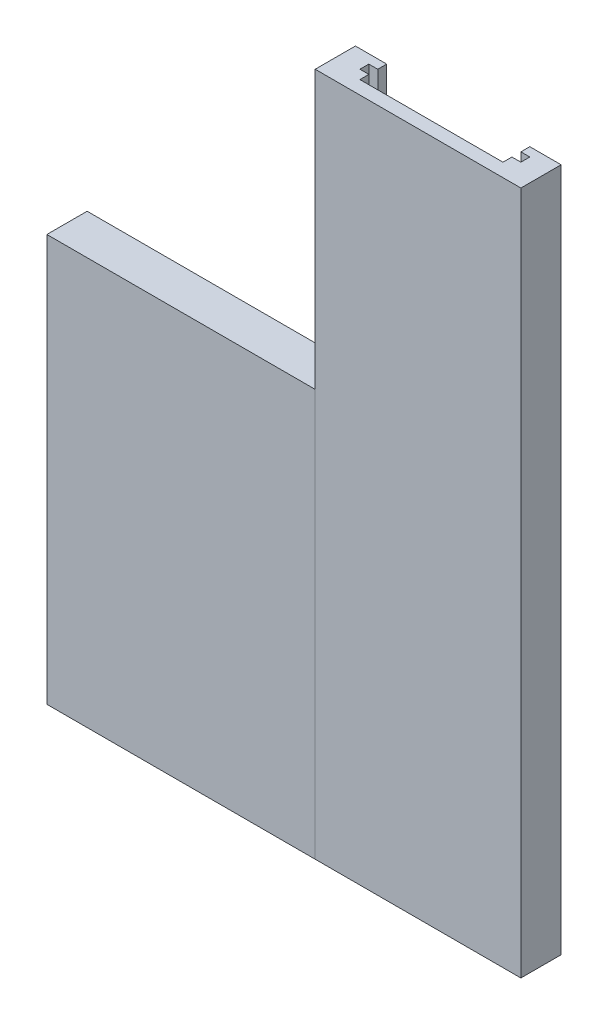
ISO-10303-21;
HEADER;
FILE_DESCRIPTION(('STEP AP214'),'2;1');
FILE_NAME('part.step','',(''),(''),'','','');
FILE_SCHEMA(('AUTOMOTIVE_DESIGN { 1 0 10303 214 1 1 1 1 }'));
ENDSEC;
DATA;
#1=APPLICATION_CONTEXT('core data for automotive mechanical design processes');
#2=APPLICATION_PROTOCOL_DEFINITION('international standard','automotive_design',2000,#1);
#3=PRODUCT_CONTEXT('',#1,'mechanical');
#4=PRODUCT('Part','Part','',(#3));
#5=PRODUCT_RELATED_PRODUCT_CATEGORY('part','',(#4));
#6=PRODUCT_DEFINITION_FORMATION('','',#4);
#7=PRODUCT_DEFINITION_CONTEXT('part definition',#1,'design');
#8=PRODUCT_DEFINITION('design','',#6,#7);
#9=PRODUCT_DEFINITION_SHAPE('','',#8);
#10=(LENGTH_UNIT() NAMED_UNIT(*) SI_UNIT(.MILLI.,.METRE.));
#11=(NAMED_UNIT(*) PLANE_ANGLE_UNIT() SI_UNIT($,.RADIAN.));
#12=(NAMED_UNIT(*) SI_UNIT($,.STERADIAN.) SOLID_ANGLE_UNIT());
#13=UNCERTAINTY_MEASURE_WITH_UNIT(LENGTH_MEASURE(1.E-05),#10,'distance_accuracy_value','');
#14=(GEOMETRIC_REPRESENTATION_CONTEXT(3) GLOBAL_UNCERTAINTY_ASSIGNED_CONTEXT((#13)) GLOBAL_UNIT_ASSIGNED_CONTEXT((#10,
#11,#12)) REPRESENTATION_CONTEXT('',''));
#15=CARTESIAN_POINT('',(0.,0.,0.));
#16=DIRECTION('',(0.,0.,1.));
#17=DIRECTION('',(1.,0.,0.));
#18=AXIS2_PLACEMENT_3D('',#15,#16,#17);
#19=CARTESIAN_POINT('',(-63.,-3.,3.));
#20=DIRECTION('',(-1.,0.,0.));
#21=DIRECTION('',(0.,0.,1.));
#22=AXIS2_PLACEMENT_3D('',#19,#20,#21);
#23=PLANE('',#22);
#24=DIRECTION('',(0.,-1.,0.));
#25=VECTOR('',#24,1.);
#26=CARTESIAN_POINT('',(-63.,-3.,9.));
#27=LINE('',#26,#25);
#28=CARTESIAN_POINT('',(-63.,88.,9.));
#29=VERTEX_POINT('',#28);
#30=CARTESIAN_POINT('',(-63.,-3.,9.));
#31=VERTEX_POINT('',#30);
#32=EDGE_CURVE('E157',#29,#31,#27,.T.);
#33=ORIENTED_EDGE('',*,*,#32,.F.);
#34=DIRECTION('',(0.,0.,1.));
#35=VECTOR('',#34,1.);
#36=CARTESIAN_POINT('',(-63.,88.,3.));
#37=LINE('',#36,#35);
#38=CARTESIAN_POINT('',(-63.,88.,0.));
#39=VERTEX_POINT('',#38);
#40=EDGE_CURVE('E12',#39,#29,#37,.T.);
#41=ORIENTED_EDGE('',*,*,#40,.F.);
#42=DIRECTION('',(0.,1.,0.));
#43=VECTOR('',#42,1.);
#44=CARTESIAN_POINT('',(-63.,-3.,0.));
#45=LINE('',#44,#43);
#46=CARTESIAN_POINT('',(-63.,-3.,0.));
#47=VERTEX_POINT('',#46);
#48=EDGE_CURVE('E124',#47,#39,#45,.T.);
#49=ORIENTED_EDGE('',*,*,#48,.F.);
#50=DIRECTION('',(0.,0.,1.));
#51=VECTOR('',#50,1.);
#52=CARTESIAN_POINT('',(-63.,-3.,3.));
#53=LINE('',#52,#51);
#54=EDGE_CURVE('E48',#47,#31,#53,.T.);
#55=ORIENTED_EDGE('',*,*,#54,.T.);
#56=EDGE_LOOP('',(#33,#41,#49,#55));
#57=FACE_BOUND('',#56,.T.);
#58=ADVANCED_FACE('F45',(#57),#23,.T.);
#59=CARTESIAN_POINT('',(-63.,88.,3.));
#60=DIRECTION('',(0.,1.,0.));
#61=DIRECTION('',(0.,0.,1.));
#62=AXIS2_PLACEMENT_3D('',#59,#60,#61);
#63=PLANE('',#62);
#64=DIRECTION('',(-1.,0.,0.));
#65=VECTOR('',#64,1.);
#66=CARTESIAN_POINT('',(-63.,88.,9.));
#67=LINE('',#66,#65);
#68=CARTESIAN_POINT('',(-3.00000000000001,88.,9.));
#69=VERTEX_POINT('',#68);
#70=EDGE_CURVE('E166',#69,#29,#67,.T.);
#71=ORIENTED_EDGE('',*,*,#70,.F.);
#72=DIRECTION('',(0.,0.,1.));
#73=VECTOR('',#72,1.);
#74=CARTESIAN_POINT('',(-3.00000000000001,88.,3.));
#75=LINE('',#74,#73);
#76=CARTESIAN_POINT('',(-3.00000000000001,88.,0.));
#77=VERTEX_POINT('',#76);
#78=EDGE_CURVE('E53',#77,#69,#75,.T.);
#79=ORIENTED_EDGE('',*,*,#78,.F.);
#80=DIRECTION('',(1.,0.,0.));
#81=VECTOR('',#80,1.);
#82=CARTESIAN_POINT('',(-63.,88.,0.));
#83=LINE('',#82,#81);
#84=EDGE_CURVE('E148',#39,#77,#83,.T.);
#85=ORIENTED_EDGE('',*,*,#84,.F.);
#86=ORIENTED_EDGE('',*,*,#40,.T.);
#87=EDGE_LOOP('',(#71,#79,#85,#86));
#88=FACE_BOUND('',#87,.T.);
#89=ADVANCED_FACE('F182',(#88),#63,.T.);
#90=CARTESIAN_POINT('',(-3.00000000000001,-3.,3.));
#91=DIRECTION('',(1.,0.,0.));
#92=DIRECTION('',(0.,0.,-1.));
#93=AXIS2_PLACEMENT_3D('',#90,#91,#92);
#94=PLANE('',#93);
#95=DIRECTION('',(0.,1.,0.));
#96=VECTOR('',#95,1.);
#97=CARTESIAN_POINT('',(-3.00000000000001,-3.,9.));
#98=LINE('',#97,#96);
#99=CARTESIAN_POINT('',(-3.00000000000001,-3.,9.));
#100=VERTEX_POINT('',#99);
#101=EDGE_CURVE('E163',#100,#69,#98,.T.);
#102=ORIENTED_EDGE('',*,*,#101,.F.);
#103=DIRECTION('',(0.,0.,1.));
#104=VECTOR('',#103,1.);
#105=CARTESIAN_POINT('',(-3.00000000000001,-3.,3.));
#106=LINE('',#105,#104);
#107=CARTESIAN_POINT('',(-3.00000000000001,-3.,0.));
#108=VERTEX_POINT('',#107);
#109=EDGE_CURVE('E169',#108,#100,#106,.T.);
#110=ORIENTED_EDGE('',*,*,#109,.F.);
#111=DIRECTION('',(0.,-1.,0.));
#112=VECTOR('',#111,1.);
#113=CARTESIAN_POINT('',(-3.00000000000001,-3.,0.));
#114=LINE('',#113,#112);
#115=EDGE_CURVE('E151',#77,#108,#114,.T.);
#116=ORIENTED_EDGE('',*,*,#115,.F.);
#117=ORIENTED_EDGE('',*,*,#78,.T.);
#118=EDGE_LOOP('',(#102,#110,#116,#117));
#119=FACE_BOUND('',#118,.T.);
#120=ADVANCED_FACE('F187',(#119),#94,.T.);
#121=CARTESIAN_POINT('',(-63.,-3.,3.));
#122=DIRECTION('',(0.,-1.,0.));
#123=DIRECTION('',(0.,0.,-1.));
#124=AXIS2_PLACEMENT_3D('',#121,#122,#123);
#125=PLANE('',#124);
#126=DIRECTION('',(1.,0.,0.));
#127=VECTOR('',#126,1.);
#128=CARTESIAN_POINT('',(-63.,-3.,9.));
#129=LINE('',#128,#127);
#130=EDGE_CURVE('E160',#31,#100,#129,.T.);
#131=ORIENTED_EDGE('',*,*,#130,.F.);
#132=ORIENTED_EDGE('',*,*,#54,.F.);
#133=DIRECTION('',(-1.,0.,0.));
#134=VECTOR('',#133,1.);
#135=CARTESIAN_POINT('',(-63.,-3.,0.));
#136=LINE('',#135,#134);
#137=EDGE_CURVE('E154',#108,#47,#136,.T.);
#138=ORIENTED_EDGE('',*,*,#137,.F.);
#139=ORIENTED_EDGE('',*,*,#109,.T.);
#140=EDGE_LOOP('',(#131,#132,#138,#139));
#141=FACE_BOUND('',#140,.T.);
#142=ADVANCED_FACE('F177',(#141),#125,.T.);
#143=CARTESIAN_POINT('',(0.,0.,9.));
#144=DIRECTION('',(0.,0.,-1.));
#145=DIRECTION('',(-1.,0.,0.));
#146=AXIS2_PLACEMENT_3D('',#143,#144,#145);
#147=PLANE('',#146);
#148=ORIENTED_EDGE('',*,*,#32,.T.);
#149=ORIENTED_EDGE('',*,*,#130,.T.);
#150=ORIENTED_EDGE('',*,*,#101,.T.);
#151=ORIENTED_EDGE('',*,*,#70,.T.);
#152=EDGE_LOOP('',(#148,#149,#150,#151));
#153=FACE_BOUND('',#152,.T.);
#154=ADVANCED_FACE('F179',(#153),#147,.F.);
#155=CARTESIAN_POINT('',(0.,0.,0.));
#156=DIRECTION('',(0.,0.,-1.));
#157=DIRECTION('',(-1.,0.,0.));
#158=AXIS2_PLACEMENT_3D('',#155,#156,#157);
#159=PLANE('',#158);
#160=ORIENTED_EDGE('',*,*,#48,.T.);
#161=ORIENTED_EDGE('',*,*,#84,.T.);
#162=ORIENTED_EDGE('',*,*,#115,.T.);
#163=ORIENTED_EDGE('',*,*,#137,.T.);
#164=EDGE_LOOP('',(#160,#161,#162,#163));
#165=FACE_BOUND('',#164,.T.);
#166=DIRECTION('',(0.,1.,0.));
#167=VECTOR('',#166,1.);
#168=CARTESIAN_POINT('',(-60.,0.,0.));
#169=LINE('',#168,#167);
#170=CARTESIAN_POINT('',(-60.,0.,0.));
#171=VERTEX_POINT('',#170);
#172=CARTESIAN_POINT('',(-60.,85.,0.));
#173=VERTEX_POINT('',#172);
#174=EDGE_CURVE('E118',#171,#173,#169,.T.);
#175=ORIENTED_EDGE('',*,*,#174,.F.);
#176=DIRECTION('',(-1.,0.,0.));
#177=VECTOR('',#176,1.);
#178=CARTESIAN_POINT('',(-60.,0.,0.));
#179=LINE('',#178,#177);
#180=CARTESIAN_POINT('',(-6.00000000000001,0.,0.));
#181=VERTEX_POINT('',#180);
#182=EDGE_CURVE('E109',#181,#171,#179,.T.);
#183=ORIENTED_EDGE('',*,*,#182,.F.);
#184=DIRECTION('',(0.,-1.,0.));
#185=VECTOR('',#184,1.);
#186=CARTESIAN_POINT('',(-6.00000000000001,0.,0.));
#187=LINE('',#186,#185);
#188=CARTESIAN_POINT('',(-6.00000000000001,85.,0.));
#189=VERTEX_POINT('',#188);
#190=EDGE_CURVE('E132',#189,#181,#187,.T.);
#191=ORIENTED_EDGE('',*,*,#190,.F.);
#192=DIRECTION('',(1.,0.,0.));
#193=VECTOR('',#192,1.);
#194=CARTESIAN_POINT('',(-60.,85.,0.));
#195=LINE('',#194,#193);
#196=EDGE_CURVE('E130',#173,#189,#195,.T.);
#197=ORIENTED_EDGE('',*,*,#196,.F.);
#198=EDGE_LOOP('',(#175,#183,#191,#197));
#199=FACE_BOUND('',#198,.T.);
#200=ADVANCED_FACE('F128',(#165,#199),#159,.T.);
#201=CARTESIAN_POINT('',(-60.,0.,0.));
#202=DIRECTION('',(0.,1.,0.));
#203=DIRECTION('',(0.,0.,1.));
#204=AXIS2_PLACEMENT_3D('',#201,#202,#203);
#205=PLANE('',#204);
#206=DIRECTION('',(-1.,0.,0.));
#207=VECTOR('',#206,1.);
#208=CARTESIAN_POINT('',(-60.,0.,3.));
#209=LINE('',#208,#207);
#210=CARTESIAN_POINT('',(-6.00000000000001,0.,3.));
#211=VERTEX_POINT('',#210);
#212=CARTESIAN_POINT('',(-60.,0.,3.));
#213=VERTEX_POINT('',#212);
#214=EDGE_CURVE('E61',#211,#213,#209,.T.);
#215=ORIENTED_EDGE('',*,*,#214,.F.);
#216=DIRECTION('',(0.,0.,1.));
#217=VECTOR('',#216,1.);
#218=CARTESIAN_POINT('',(-6.00000000000001,0.,0.));
#219=LINE('',#218,#217);
#220=EDGE_CURVE('E114',#181,#211,#219,.T.);
#221=ORIENTED_EDGE('',*,*,#220,.F.);
#222=ORIENTED_EDGE('',*,*,#182,.T.);
#223=DIRECTION('',(0.,0.,1.));
#224=VECTOR('',#223,1.);
#225=CARTESIAN_POINT('',(-60.,0.,0.));
#226=LINE('',#225,#224);
#227=EDGE_CURVE('E112',#171,#213,#226,.T.);
#228=ORIENTED_EDGE('',*,*,#227,.T.);
#229=EDGE_LOOP('',(#215,#221,#222,#228));
#230=FACE_BOUND('',#229,.T.);
#231=ADVANCED_FACE('F111',(#230),#205,.T.);
#232=CARTESIAN_POINT('',(-60.,0.,0.));
#233=DIRECTION('',(1.,0.,0.));
#234=DIRECTION('',(0.,0.,-1.));
#235=AXIS2_PLACEMENT_3D('',#232,#233,#234);
#236=PLANE('',#235);
#237=DIRECTION('',(0.,1.,0.));
#238=VECTOR('',#237,1.);
#239=CARTESIAN_POINT('',(-60.,0.,3.));
#240=LINE('',#239,#238);
#241=CARTESIAN_POINT('',(-60.,85.,3.));
#242=VERTEX_POINT('',#241);
#243=EDGE_CURVE('E65',#213,#242,#240,.T.);
#244=ORIENTED_EDGE('',*,*,#243,.F.);
#245=ORIENTED_EDGE('',*,*,#227,.F.);
#246=ORIENTED_EDGE('',*,*,#174,.T.);
#247=DIRECTION('',(0.,0.,1.));
#248=VECTOR('',#247,1.);
#249=CARTESIAN_POINT('',(-60.,85.,0.));
#250=LINE('',#249,#248);
#251=EDGE_CURVE('E125',#173,#242,#250,.T.);
#252=ORIENTED_EDGE('',*,*,#251,.T.);
#253=EDGE_LOOP('',(#244,#245,#246,#252));
#254=FACE_BOUND('',#253,.T.);
#255=ADVANCED_FACE('F122',(#254),#236,.T.);
#256=CARTESIAN_POINT('',(-60.,85.,0.));
#257=DIRECTION('',(0.,-1.,0.));
#258=DIRECTION('',(0.,0.,-1.));
#259=AXIS2_PLACEMENT_3D('',#256,#257,#258);
#260=PLANE('',#259);
#261=DIRECTION('',(1.,0.,0.));
#262=VECTOR('',#261,1.);
#263=CARTESIAN_POINT('',(-60.,85.,3.));
#264=LINE('',#263,#262);
#265=CARTESIAN_POINT('',(-6.00000000000001,85.,3.));
#266=VERTEX_POINT('',#265);
#267=EDGE_CURVE('E138',#242,#266,#264,.T.);
#268=ORIENTED_EDGE('',*,*,#267,.F.);
#269=ORIENTED_EDGE('',*,*,#251,.F.);
#270=ORIENTED_EDGE('',*,*,#196,.T.);
#271=DIRECTION('',(0.,0.,1.));
#272=VECTOR('',#271,1.);
#273=CARTESIAN_POINT('',(-6.00000000000001,85.,0.));
#274=LINE('',#273,#272);
#275=EDGE_CURVE('E142',#189,#266,#274,.T.);
#276=ORIENTED_EDGE('',*,*,#275,.T.);
#277=EDGE_LOOP('',(#268,#269,#270,#276));
#278=FACE_BOUND('',#277,.T.);
#279=ADVANCED_FACE('F242',(#278),#260,.T.);
#280=CARTESIAN_POINT('',(-6.00000000000001,0.,0.));
#281=DIRECTION('',(-1.,0.,0.));
#282=DIRECTION('',(0.,-1.,0.));
#283=AXIS2_PLACEMENT_3D('',#280,#281,#282);
#284=PLANE('',#283);
#285=DIRECTION('',(0.,-1.,0.));
#286=VECTOR('',#285,1.);
#287=CARTESIAN_POINT('',(-6.00000000000001,0.,3.));
#288=LINE('',#287,#286);
#289=EDGE_CURVE('E119',#266,#211,#288,.T.);
#290=ORIENTED_EDGE('',*,*,#289,.F.);
#291=ORIENTED_EDGE('',*,*,#275,.F.);
#292=ORIENTED_EDGE('',*,*,#190,.T.);
#293=ORIENTED_EDGE('',*,*,#220,.T.);
#294=EDGE_LOOP('',(#290,#291,#292,#293));
#295=FACE_BOUND('',#294,.T.);
#296=ADVANCED_FACE('F251',(#295),#284,.T.);
#297=CARTESIAN_POINT('',(0.,0.,3.));
#298=DIRECTION('',(0.,0.,-1.));
#299=DIRECTION('',(-1.,0.,0.));
#300=AXIS2_PLACEMENT_3D('',#297,#298,#299);
#301=PLANE('',#300);
#302=ORIENTED_EDGE('',*,*,#214,.T.);
#303=ORIENTED_EDGE('',*,*,#243,.T.);
#304=ORIENTED_EDGE('',*,*,#267,.T.);
#305=ORIENTED_EDGE('',*,*,#289,.T.);
#306=EDGE_LOOP('',(#302,#303,#304,#305));
#307=FACE_BOUND('',#306,.T.);
#308=ADVANCED_FACE('F261',(#307),#301,.T.);
#309=CLOSED_SHELL('',(#58,#89,#120,#142,#154,#200,#231,#255,#279,#296,#308));
#310=MANIFOLD_SOLID_BREP('B2',#309);
#311=CARTESIAN_POINT('',(0.,0.,6.));
#312=DIRECTION('',(0.,1.,0.));
#313=DIRECTION('',(0.,0.,1.));
#314=AXIS2_PLACEMENT_3D('',#311,#312,#313);
#315=PLANE('',#314);
#316=DIRECTION('',(0.,0.,1.));
#317=VECTOR('',#316,1.);
#318=CARTESIAN_POINT('',(36.,0.,6.));
#319=LINE('',#318,#317);
#320=CARTESIAN_POINT('',(36.,0.,0.));
#321=VERTEX_POINT('',#320);
#322=CARTESIAN_POINT('',(36.,0.,2.));
#323=VERTEX_POINT('',#322);
#324=EDGE_CURVE('E448',#321,#323,#319,.T.);
#325=ORIENTED_EDGE('',*,*,#324,.F.);
#326=DIRECTION('',(1.,0.,0.));
#327=VECTOR('',#326,1.);
#328=CARTESIAN_POINT('',(0.,0.,0.));
#329=LINE('',#328,#327);
#330=CARTESIAN_POINT('',(4.,0.,0.));
#331=VERTEX_POINT('',#330);
#332=EDGE_CURVE('E518',#331,#321,#329,.T.);
#333=ORIENTED_EDGE('',*,*,#332,.F.);
#334=DIRECTION('',(0.,0.,-1.));
#335=VECTOR('',#334,1.);
#336=CARTESIAN_POINT('',(4.,0.,6.));
#337=LINE('',#336,#335);
#338=CARTESIAN_POINT('',(4.,0.,2.));
#339=VERTEX_POINT('',#338);
#340=EDGE_CURVE('E489',#339,#331,#337,.T.);
#341=ORIENTED_EDGE('',*,*,#340,.F.);
#342=DIRECTION('',(1.,0.,0.));
#343=VECTOR('',#342,1.);
#344=CARTESIAN_POINT('',(0.,0.,2.));
#345=LINE('',#344,#343);
#346=CARTESIAN_POINT('',(2.,0.,2.));
#347=VERTEX_POINT('',#346);
#348=EDGE_CURVE('E491',#347,#339,#345,.T.);
#349=ORIENTED_EDGE('',*,*,#348,.F.);
#350=DIRECTION('',(0.,0.,-1.));
#351=VECTOR('',#350,1.);
#352=CARTESIAN_POINT('',(2.,0.,6.));
#353=LINE('',#352,#351);
#354=CARTESIAN_POINT('',(2.,0.,4.));
#355=VERTEX_POINT('',#354);
#356=EDGE_CURVE('E493',#355,#347,#353,.T.);
#357=ORIENTED_EDGE('',*,*,#356,.F.);
#358=DIRECTION('',(-1.,0.,0.));
#359=VECTOR('',#358,1.);
#360=CARTESIAN_POINT('',(0.,0.,4.));
#361=LINE('',#360,#359);
#362=CARTESIAN_POINT('',(4.,0.,4.));
#363=VERTEX_POINT('',#362);
#364=EDGE_CURVE('E495',#363,#355,#361,.T.);
#365=ORIENTED_EDGE('',*,*,#364,.F.);
#366=DIRECTION('',(0.,0.,-1.));
#367=VECTOR('',#366,1.);
#368=CARTESIAN_POINT('',(4.,0.,6.));
#369=LINE('',#368,#367);
#370=CARTESIAN_POINT('',(4.,0.,6.));
#371=VERTEX_POINT('',#370);
#372=EDGE_CURVE('E473',#371,#363,#369,.T.);
#373=ORIENTED_EDGE('',*,*,#372,.F.);
#374=DIRECTION('',(1.,0.,0.));
#375=VECTOR('',#374,1.);
#376=CARTESIAN_POINT('',(0.,0.,6.));
#377=LINE('',#376,#375);
#378=CARTESIAN_POINT('',(36.,0.,6.));
#379=VERTEX_POINT('',#378);
#380=EDGE_CURVE('E512',#371,#379,#377,.T.);
#381=ORIENTED_EDGE('',*,*,#380,.T.);
#382=DIRECTION('',(0.,0.,1.));
#383=VECTOR('',#382,1.);
#384=CARTESIAN_POINT('',(36.,0.,6.));
#385=LINE('',#384,#383);
#386=CARTESIAN_POINT('',(36.,0.,4.));
#387=VERTEX_POINT('',#386);
#388=EDGE_CURVE('E438',#387,#379,#385,.T.);
#389=ORIENTED_EDGE('',*,*,#388,.F.);
#390=DIRECTION('',(-1.,0.,0.));
#391=VECTOR('',#390,1.);
#392=CARTESIAN_POINT('',(0.,0.,4.));
#393=LINE('',#392,#391);
#394=CARTESIAN_POINT('',(38.,0.,4.));
#395=VERTEX_POINT('',#394);
#396=EDGE_CURVE('E412',#395,#387,#393,.T.);
#397=ORIENTED_EDGE('',*,*,#396,.F.);
#398=DIRECTION('',(0.,0.,1.));
#399=VECTOR('',#398,1.);
#400=CARTESIAN_POINT('',(38.,0.,6.));
#401=LINE('',#400,#399);
#402=CARTESIAN_POINT('',(38.,0.,2.));
#403=VERTEX_POINT('',#402);
#404=EDGE_CURVE('E451',#403,#395,#401,.T.);
#405=ORIENTED_EDGE('',*,*,#404,.F.);
#406=DIRECTION('',(1.,0.,0.));
#407=VECTOR('',#406,1.);
#408=CARTESIAN_POINT('',(0.,0.,1.99999999999999));
#409=LINE('',#408,#407);
#410=EDGE_CURVE('E453',#323,#403,#409,.T.);
#411=ORIENTED_EDGE('',*,*,#410,.F.);
#412=EDGE_LOOP('',(#325,#333,#341,#349,#357,#365,#373,#381,#389,#397,#405,#411));
#413=FACE_BOUND('',#412,.T.);
#414=ADVANCED_FACE('F296',(#413),#315,.T.);
#415=CARTESIAN_POINT('',(0.,150.,6.));
#416=DIRECTION('',(0.,-1.,0.));
#417=DIRECTION('',(0.,0.,-1.));
#418=AXIS2_PLACEMENT_3D('',#415,#416,#417);
#419=PLANE('',#418);
#420=DIRECTION('',(1.,0.,0.));
#421=VECTOR('',#420,1.);
#422=CARTESIAN_POINT('',(0.,150.,0.));
#423=LINE('',#422,#421);
#424=CARTESIAN_POINT('',(36.,150.,0.));
#425=VERTEX_POINT('',#424);
#426=CARTESIAN_POINT('',(43.,150.,0.));
#427=VERTEX_POINT('',#426);
#428=EDGE_CURVE('E510',#425,#427,#423,.T.);
#429=ORIENTED_EDGE('',*,*,#428,.F.);
#430=DIRECTION('',(0.,0.,-1.));
#431=VECTOR('',#430,1.);
#432=CARTESIAN_POINT('',(36.,150.,0.));
#433=LINE('',#432,#431);
#434=CARTESIAN_POINT('',(36.,150.,2.));
#435=VERTEX_POINT('',#434);
#436=EDGE_CURVE('E433',#435,#425,#433,.T.);
#437=ORIENTED_EDGE('',*,*,#436,.F.);
#438=DIRECTION('',(-1.,0.,0.));
#439=VECTOR('',#438,1.);
#440=CARTESIAN_POINT('',(38.,150.,2.));
#441=LINE('',#440,#439);
#442=CARTESIAN_POINT('',(38.,150.,2.));
#443=VERTEX_POINT('',#442);
#444=EDGE_CURVE('E430',#443,#435,#441,.T.);
#445=ORIENTED_EDGE('',*,*,#444,.F.);
#446=DIRECTION('',(0.,0.,-1.));
#447=VECTOR('',#446,1.);
#448=CARTESIAN_POINT('',(38.,150.,2.));
#449=LINE('',#448,#447);
#450=CARTESIAN_POINT('',(38.,150.,4.));
#451=VERTEX_POINT('',#450);
#452=EDGE_CURVE('E422',#451,#443,#449,.T.);
#453=ORIENTED_EDGE('',*,*,#452,.F.);
#454=DIRECTION('',(1.,0.,0.));
#455=VECTOR('',#454,1.);
#456=CARTESIAN_POINT('',(38.,150.,4.));
#457=LINE('',#456,#455);
#458=CARTESIAN_POINT('',(36.,150.,4.));
#459=VERTEX_POINT('',#458);
#460=EDGE_CURVE('E410',#459,#451,#457,.T.);
#461=ORIENTED_EDGE('',*,*,#460,.F.);
#462=DIRECTION('',(0.,0.,-1.));
#463=VECTOR('',#462,1.);
#464=CARTESIAN_POINT('',(36.,150.,4.));
#465=LINE('',#464,#463);
#466=CARTESIAN_POINT('',(36.,150.,6.));
#467=VERTEX_POINT('',#466);
#468=EDGE_CURVE('E310',#467,#459,#465,.T.);
#469=ORIENTED_EDGE('',*,*,#468,.F.);
#470=DIRECTION('',(-1.,0.,0.));
#471=VECTOR('',#470,1.);
#472=CARTESIAN_POINT('',(-3.00000000000001,150.,6.));
#473=LINE('',#472,#471);
#474=CARTESIAN_POINT('',(4.,150.,6.));
#475=VERTEX_POINT('',#474);
#476=EDGE_CURVE('E497',#467,#475,#473,.T.);
#477=ORIENTED_EDGE('',*,*,#476,.T.);
#478=DIRECTION('',(0.,0.,1.));
#479=VECTOR('',#478,1.);
#480=CARTESIAN_POINT('',(4.,150.,4.));
#481=LINE('',#480,#479);
#482=CARTESIAN_POINT('',(4.,150.,4.));
#483=VERTEX_POINT('',#482);
#484=EDGE_CURVE('E467',#483,#475,#481,.T.);
#485=ORIENTED_EDGE('',*,*,#484,.F.);
#486=DIRECTION('',(1.,0.,0.));
#487=VECTOR('',#486,1.);
#488=CARTESIAN_POINT('',(2.,150.,4.));
#489=LINE('',#488,#487);
#490=CARTESIAN_POINT('',(2.,150.,4.));
#491=VERTEX_POINT('',#490);
#492=EDGE_CURVE('E464',#491,#483,#489,.T.);
#493=ORIENTED_EDGE('',*,*,#492,.F.);
#494=DIRECTION('',(0.,0.,1.));
#495=VECTOR('',#494,1.);
#496=CARTESIAN_POINT('',(2.,150.,2.));
#497=LINE('',#496,#495);
#498=CARTESIAN_POINT('',(2.,150.,2.));
#499=VERTEX_POINT('',#498);
#500=EDGE_CURVE('E461',#499,#491,#497,.T.);
#501=ORIENTED_EDGE('',*,*,#500,.F.);
#502=DIRECTION('',(-1.,0.,0.));
#503=VECTOR('',#502,1.);
#504=CARTESIAN_POINT('',(2.,150.,2.));
#505=LINE('',#504,#503);
#506=CARTESIAN_POINT('',(4.,150.,2.));
#507=VERTEX_POINT('',#506);
#508=EDGE_CURVE('E458',#507,#499,#505,.T.);
#509=ORIENTED_EDGE('',*,*,#508,.F.);
#510=DIRECTION('',(0.,0.,1.));
#511=VECTOR('',#510,1.);
#512=CARTESIAN_POINT('',(4.,150.,0.));
#513=LINE('',#512,#511);
#514=CARTESIAN_POINT('',(4.,150.,0.));
#515=VERTEX_POINT('',#514);
#516=EDGE_CURVE('E455',#515,#507,#513,.T.);
#517=ORIENTED_EDGE('',*,*,#516,.F.);
#518=DIRECTION('',(-1.,0.,0.));
#519=VECTOR('',#518,1.);
#520=CARTESIAN_POINT('',(0.,150.,0.));
#521=LINE('',#520,#519);
#522=CARTESIAN_POINT('',(-3.00000000000001,150.,0.));
#523=VERTEX_POINT('',#522);
#524=EDGE_CURVE('E521',#515,#523,#521,.T.);
#525=ORIENTED_EDGE('',*,*,#524,.T.);
#526=DIRECTION('',(0.,0.,-1.));
#527=VECTOR('',#526,1.);
#528=CARTESIAN_POINT('',(-3.00000000000001,150.,6.));
#529=LINE('',#528,#527);
#530=CARTESIAN_POINT('',(-3.00000000000001,150.,9.));
#531=VERTEX_POINT('',#530);
#532=EDGE_CURVE('E43',#531,#523,#529,.T.);
#533=ORIENTED_EDGE('',*,*,#532,.F.);
#534=DIRECTION('',(-1.,0.,0.));
#535=VECTOR('',#534,1.);
#536=CARTESIAN_POINT('',(-3.00000000000001,150.,9.));
#537=LINE('',#536,#535);
#538=CARTESIAN_POINT('',(43.,150.,9.));
#539=VERTEX_POINT('',#538);
#540=EDGE_CURVE('E507',#539,#531,#537,.T.);
#541=ORIENTED_EDGE('',*,*,#540,.F.);
#542=DIRECTION('',(0.,0.,-1.));
#543=VECTOR('',#542,1.);
#544=CARTESIAN_POINT('',(43.,150.,6.));
#545=LINE('',#544,#543);
#546=EDGE_CURVE('E317',#539,#427,#545,.T.);
#547=ORIENTED_EDGE('',*,*,#546,.T.);
#548=EDGE_LOOP('',(#429,#437,#445,#453,#461,#469,#477,#485,#493,#501,#509,#517,#525,#533,#541,#547));
#549=FACE_BOUND('',#548,.T.);
#550=ADVANCED_FACE('F419',(#549),#419,.F.);
#551=CARTESIAN_POINT('',(-3.00000000000001,0.,6.));
#552=DIRECTION('',(-1.,0.,0.));
#553=DIRECTION('',(0.,-1.,0.));
#554=AXIS2_PLACEMENT_3D('',#551,#552,#553);
#555=PLANE('',#554);
#556=DIRECTION('',(0.,1.,0.));
#557=VECTOR('',#556,1.);
#558=CARTESIAN_POINT('',(-3.00000000000001,0.,0.));
#559=LINE('',#558,#557);
#560=CARTESIAN_POINT('',(-3.00000000000001,-3.,0.));
#561=VERTEX_POINT('',#560);
#562=EDGE_CURVE('E524',#561,#523,#559,.T.);
#563=ORIENTED_EDGE('',*,*,#562,.F.);
#564=DIRECTION('',(0.,0.,-1.));
#565=VECTOR('',#564,1.);
#566=CARTESIAN_POINT('',(-3.00000000000001,-3.,6.));
#567=LINE('',#566,#565);
#568=CARTESIAN_POINT('',(-3.00000000000001,-3.,9.));
#569=VERTEX_POINT('',#568);
#570=EDGE_CURVE('E303',#569,#561,#567,.T.);
#571=ORIENTED_EDGE('',*,*,#570,.F.);
#572=DIRECTION('',(0.,-1.,0.));
#573=VECTOR('',#572,1.);
#574=CARTESIAN_POINT('',(-3.00000000000001,-3.,9.));
#575=LINE('',#574,#573);
#576=EDGE_CURVE('E498',#531,#569,#575,.T.);
#577=ORIENTED_EDGE('',*,*,#576,.F.);
#578=ORIENTED_EDGE('',*,*,#532,.T.);
#579=EDGE_LOOP('',(#563,#571,#577,#578));
#580=FACE_BOUND('',#579,.T.);
#581=ADVANCED_FACE('F543',(#580),#555,.T.);
#582=CARTESIAN_POINT('',(0.,-3.,6.));
#583=DIRECTION('',(0.,1.,0.));
#584=DIRECTION('',(0.,0.,1.));
#585=AXIS2_PLACEMENT_3D('',#582,#583,#584);
#586=PLANE('',#585);
#587=DIRECTION('',(1.,0.,0.));
#588=VECTOR('',#587,1.);
#589=CARTESIAN_POINT('',(0.,-3.,0.));
#590=LINE('',#589,#588);
#591=CARTESIAN_POINT('',(43.,-3.,0.));
#592=VERTEX_POINT('',#591);
#593=EDGE_CURVE('E527',#561,#592,#590,.T.);
#594=ORIENTED_EDGE('',*,*,#593,.T.);
#595=DIRECTION('',(0.,0.,-1.));
#596=VECTOR('',#595,1.);
#597=CARTESIAN_POINT('',(43.,-3.,6.));
#598=LINE('',#597,#596);
#599=CARTESIAN_POINT('',(43.,-3.,9.));
#600=VERTEX_POINT('',#599);
#601=EDGE_CURVE('E531',#600,#592,#598,.T.);
#602=ORIENTED_EDGE('',*,*,#601,.F.);
#603=DIRECTION('',(1.,0.,0.));
#604=VECTOR('',#603,1.);
#605=CARTESIAN_POINT('',(-3.00000000000001,-3.,9.));
#606=LINE('',#605,#604);
#607=EDGE_CURVE('E501',#569,#600,#606,.T.);
#608=ORIENTED_EDGE('',*,*,#607,.F.);
#609=ORIENTED_EDGE('',*,*,#570,.T.);
#610=EDGE_LOOP('',(#594,#602,#608,#609));
#611=FACE_BOUND('',#610,.T.);
#612=ADVANCED_FACE('F536',(#611),#586,.F.);
#613=CARTESIAN_POINT('',(43.,0.,6.));
#614=DIRECTION('',(-1.,0.,0.));
#615=DIRECTION('',(0.,0.,1.));
#616=AXIS2_PLACEMENT_3D('',#613,#614,#615);
#617=PLANE('',#616);
#618=DIRECTION('',(0.,1.,0.));
#619=VECTOR('',#618,1.);
#620=CARTESIAN_POINT('',(43.,0.,0.));
#621=LINE('',#620,#619);
#622=EDGE_CURVE('E515',#592,#427,#621,.T.);
#623=ORIENTED_EDGE('',*,*,#622,.T.);
#624=ORIENTED_EDGE('',*,*,#546,.F.);
#625=DIRECTION('',(0.,1.,0.));
#626=VECTOR('',#625,1.);
#627=CARTESIAN_POINT('',(43.,-3.,9.));
#628=LINE('',#627,#626);
#629=EDGE_CURVE('E504',#600,#539,#628,.T.);
#630=ORIENTED_EDGE('',*,*,#629,.F.);
#631=ORIENTED_EDGE('',*,*,#601,.T.);
#632=EDGE_LOOP('',(#623,#624,#630,#631));
#633=FACE_BOUND('',#632,.T.);
#634=ADVANCED_FACE('F601',(#633),#617,.F.);
#635=CARTESIAN_POINT('',(0.,0.,0.));
#636=DIRECTION('',(0.,0.,1.));
#637=DIRECTION('',(1.,0.,0.));
#638=AXIS2_PLACEMENT_3D('',#635,#636,#637);
#639=PLANE('',#638);
#640=ORIENTED_EDGE('',*,*,#332,.T.);
#641=DIRECTION('',(0.,-1.,0.));
#642=VECTOR('',#641,1.);
#643=CARTESIAN_POINT('',(36.,150.,0.));
#644=LINE('',#643,#642);
#645=EDGE_CURVE('E436',#425,#321,#644,.T.);
#646=ORIENTED_EDGE('',*,*,#645,.F.);
#647=ORIENTED_EDGE('',*,*,#428,.T.);
#648=ORIENTED_EDGE('',*,*,#622,.F.);
#649=ORIENTED_EDGE('',*,*,#593,.F.);
#650=ORIENTED_EDGE('',*,*,#562,.T.);
#651=ORIENTED_EDGE('',*,*,#524,.F.);
#652=DIRECTION('',(0.,-1.,0.));
#653=VECTOR('',#652,1.);
#654=CARTESIAN_POINT('',(4.,150.,0.));
#655=LINE('',#654,#653);
#656=EDGE_CURVE('E470',#515,#331,#655,.T.);
#657=ORIENTED_EDGE('',*,*,#656,.T.);
#658=EDGE_LOOP('',(#640,#646,#647,#648,#649,#650,#651,#657));
#659=FACE_BOUND('',#658,.T.);
#660=ADVANCED_FACE('F542',(#659),#639,.F.);
#661=CARTESIAN_POINT('',(0.,0.,6.));
#662=DIRECTION('',(0.,0.,-1.));
#663=DIRECTION('',(-1.,0.,0.));
#664=AXIS2_PLACEMENT_3D('',#661,#662,#663);
#665=PLANE('',#664);
#666=DIRECTION('',(0.,-1.,0.));
#667=VECTOR('',#666,1.);
#668=CARTESIAN_POINT('',(36.,150.,6.));
#669=LINE('',#668,#667);
#670=EDGE_CURVE('E416',#467,#379,#669,.T.);
#671=ORIENTED_EDGE('',*,*,#670,.T.);
#672=ORIENTED_EDGE('',*,*,#380,.F.);
#673=DIRECTION('',(0.,-1.,0.));
#674=VECTOR('',#673,1.);
#675=CARTESIAN_POINT('',(4.,150.,6.));
#676=LINE('',#675,#674);
#677=EDGE_CURVE('E471',#475,#371,#676,.T.);
#678=ORIENTED_EDGE('',*,*,#677,.F.);
#679=ORIENTED_EDGE('',*,*,#476,.F.);
#680=EDGE_LOOP('',(#671,#672,#678,#679));
#681=FACE_BOUND('',#680,.T.);
#682=ADVANCED_FACE('F568',(#681),#665,.T.);
#683=CARTESIAN_POINT('',(0.,0.,9.));
#684=DIRECTION('',(0.,0.,-1.));
#685=DIRECTION('',(-1.,0.,0.));
#686=AXIS2_PLACEMENT_3D('',#683,#684,#685);
#687=PLANE('',#686);
#688=ORIENTED_EDGE('',*,*,#576,.T.);
#689=ORIENTED_EDGE('',*,*,#607,.T.);
#690=ORIENTED_EDGE('',*,*,#629,.T.);
#691=ORIENTED_EDGE('',*,*,#540,.T.);
#692=EDGE_LOOP('',(#688,#689,#690,#691));
#693=FACE_BOUND('',#692,.T.);
#694=ADVANCED_FACE('F609',(#693),#687,.F.);
#695=CARTESIAN_POINT('',(4.,150.,4.));
#696=DIRECTION('',(1.,0.,0.));
#697=DIRECTION('',(0.,0.,-1.));
#698=AXIS2_PLACEMENT_3D('',#695,#696,#697);
#699=PLANE('',#698);
#700=ORIENTED_EDGE('',*,*,#677,.T.);
#701=ORIENTED_EDGE('',*,*,#372,.T.);
#702=DIRECTION('',(0.,-1.,0.));
#703=VECTOR('',#702,1.);
#704=CARTESIAN_POINT('',(4.,150.,4.));
#705=LINE('',#704,#703);
#706=EDGE_CURVE('E474',#483,#363,#705,.T.);
#707=ORIENTED_EDGE('',*,*,#706,.F.);
#708=ORIENTED_EDGE('',*,*,#484,.T.);
#709=EDGE_LOOP('',(#700,#701,#707,#708));
#710=FACE_BOUND('',#709,.T.);
#711=ADVANCED_FACE('F573',(#710),#699,.T.);
#712=CARTESIAN_POINT('',(2.,150.,4.));
#713=DIRECTION('',(0.,0.,-1.));
#714=DIRECTION('',(-1.,0.,0.));
#715=AXIS2_PLACEMENT_3D('',#712,#713,#714);
#716=PLANE('',#715);
#717=ORIENTED_EDGE('',*,*,#706,.T.);
#718=ORIENTED_EDGE('',*,*,#364,.T.);
#719=DIRECTION('',(0.,-1.,0.));
#720=VECTOR('',#719,1.);
#721=CARTESIAN_POINT('',(2.,150.,4.));
#722=LINE('',#721,#720);
#723=EDGE_CURVE('E477',#491,#355,#722,.T.);
#724=ORIENTED_EDGE('',*,*,#723,.F.);
#725=ORIENTED_EDGE('',*,*,#492,.T.);
#726=EDGE_LOOP('',(#717,#718,#724,#725));
#727=FACE_BOUND('',#726,.T.);
#728=ADVANCED_FACE('F576',(#727),#716,.T.);
#729=CARTESIAN_POINT('',(2.,150.,2.));
#730=DIRECTION('',(1.,0.,0.));
#731=DIRECTION('',(0.,0.,-1.));
#732=AXIS2_PLACEMENT_3D('',#729,#730,#731);
#733=PLANE('',#732);
#734=ORIENTED_EDGE('',*,*,#723,.T.);
#735=ORIENTED_EDGE('',*,*,#356,.T.);
#736=DIRECTION('',(0.,-1.,0.));
#737=VECTOR('',#736,1.);
#738=CARTESIAN_POINT('',(2.,150.,2.));
#739=LINE('',#738,#737);
#740=EDGE_CURVE('E480',#499,#347,#739,.T.);
#741=ORIENTED_EDGE('',*,*,#740,.F.);
#742=ORIENTED_EDGE('',*,*,#500,.T.);
#743=EDGE_LOOP('',(#734,#735,#741,#742));
#744=FACE_BOUND('',#743,.T.);
#745=ADVANCED_FACE('F578',(#744),#733,.T.);
#746=CARTESIAN_POINT('',(2.,150.,2.));
#747=DIRECTION('',(0.,0.,1.));
#748=DIRECTION('',(1.,0.,0.));
#749=AXIS2_PLACEMENT_3D('',#746,#747,#748);
#750=PLANE('',#749);
#751=ORIENTED_EDGE('',*,*,#740,.T.);
#752=ORIENTED_EDGE('',*,*,#348,.T.);
#753=DIRECTION('',(0.,-1.,0.));
#754=VECTOR('',#753,1.);
#755=CARTESIAN_POINT('',(4.,150.,2.));
#756=LINE('',#755,#754);
#757=EDGE_CURVE('E483',#507,#339,#756,.T.);
#758=ORIENTED_EDGE('',*,*,#757,.F.);
#759=ORIENTED_EDGE('',*,*,#508,.T.);
#760=EDGE_LOOP('',(#751,#752,#758,#759));
#761=FACE_BOUND('',#760,.T.);
#762=ADVANCED_FACE('F581',(#761),#750,.T.);
#763=CARTESIAN_POINT('',(4.,150.,0.));
#764=DIRECTION('',(1.,0.,0.));
#765=DIRECTION('',(0.,0.,-1.));
#766=AXIS2_PLACEMENT_3D('',#763,#764,#765);
#767=PLANE('',#766);
#768=ORIENTED_EDGE('',*,*,#757,.T.);
#769=ORIENTED_EDGE('',*,*,#340,.T.);
#770=ORIENTED_EDGE('',*,*,#656,.F.);
#771=ORIENTED_EDGE('',*,*,#516,.T.);
#772=EDGE_LOOP('',(#768,#769,#770,#771));
#773=FACE_BOUND('',#772,.T.);
#774=ADVANCED_FACE('F549',(#773),#767,.T.);
#775=CARTESIAN_POINT('',(36.,150.,0.));
#776=DIRECTION('',(-1.,0.,0.));
#777=DIRECTION('',(0.,0.,1.));
#778=AXIS2_PLACEMENT_3D('',#775,#776,#777);
#779=PLANE('',#778);
#780=ORIENTED_EDGE('',*,*,#645,.T.);
#781=ORIENTED_EDGE('',*,*,#324,.T.);
#782=DIRECTION('',(0.,-1.,0.));
#783=VECTOR('',#782,1.);
#784=CARTESIAN_POINT('',(36.,150.,2.));
#785=LINE('',#784,#783);
#786=EDGE_CURVE('E439',#435,#323,#785,.T.);
#787=ORIENTED_EDGE('',*,*,#786,.F.);
#788=ORIENTED_EDGE('',*,*,#436,.T.);
#789=EDGE_LOOP('',(#780,#781,#787,#788));
#790=FACE_BOUND('',#789,.T.);
#791=ADVANCED_FACE('F559',(#790),#779,.T.);
#792=CARTESIAN_POINT('',(38.,150.,2.));
#793=DIRECTION('',(0.,0.,1.));
#794=DIRECTION('',(1.,0.,0.));
#795=AXIS2_PLACEMENT_3D('',#792,#793,#794);
#796=PLANE('',#795);
#797=ORIENTED_EDGE('',*,*,#786,.T.);
#798=ORIENTED_EDGE('',*,*,#410,.T.);
#799=DIRECTION('',(0.,-1.,0.));
#800=VECTOR('',#799,1.);
#801=CARTESIAN_POINT('',(38.,150.,2.));
#802=LINE('',#801,#800);
#803=EDGE_CURVE('E442',#443,#403,#802,.T.);
#804=ORIENTED_EDGE('',*,*,#803,.F.);
#805=ORIENTED_EDGE('',*,*,#444,.T.);
#806=EDGE_LOOP('',(#797,#798,#804,#805));
#807=FACE_BOUND('',#806,.T.);
#808=ADVANCED_FACE('F561',(#807),#796,.T.);
#809=CARTESIAN_POINT('',(38.,150.,2.));
#810=DIRECTION('',(-1.,0.,0.));
#811=DIRECTION('',(0.,0.,1.));
#812=AXIS2_PLACEMENT_3D('',#809,#810,#811);
#813=PLANE('',#812);
#814=ORIENTED_EDGE('',*,*,#803,.T.);
#815=ORIENTED_EDGE('',*,*,#404,.T.);
#816=DIRECTION('',(0.,-1.,0.));
#817=VECTOR('',#816,1.);
#818=CARTESIAN_POINT('',(38.,150.,4.));
#819=LINE('',#818,#817);
#820=EDGE_CURVE('E415',#451,#395,#819,.T.);
#821=ORIENTED_EDGE('',*,*,#820,.F.);
#822=ORIENTED_EDGE('',*,*,#452,.T.);
#823=EDGE_LOOP('',(#814,#815,#821,#822));
#824=FACE_BOUND('',#823,.T.);
#825=ADVANCED_FACE('F564',(#824),#813,.T.);
#826=CARTESIAN_POINT('',(38.,150.,4.));
#827=DIRECTION('',(0.,0.,-1.));
#828=DIRECTION('',(-1.,0.,0.));
#829=AXIS2_PLACEMENT_3D('',#826,#827,#828);
#830=PLANE('',#829);
#831=ORIENTED_EDGE('',*,*,#820,.T.);
#832=ORIENTED_EDGE('',*,*,#396,.T.);
#833=DIRECTION('',(0.,-1.,0.));
#834=VECTOR('',#833,1.);
#835=CARTESIAN_POINT('',(36.,150.,4.));
#836=LINE('',#835,#834);
#837=EDGE_CURVE('E407',#459,#387,#836,.T.);
#838=ORIENTED_EDGE('',*,*,#837,.F.);
#839=ORIENTED_EDGE('',*,*,#460,.T.);
#840=EDGE_LOOP('',(#831,#832,#838,#839));
#841=FACE_BOUND('',#840,.T.);
#842=ADVANCED_FACE('F409',(#841),#830,.T.);
#843=CARTESIAN_POINT('',(36.,150.,4.));
#844=DIRECTION('',(-1.,0.,0.));
#845=DIRECTION('',(0.,0.,1.));
#846=AXIS2_PLACEMENT_3D('',#843,#844,#845);
#847=PLANE('',#846);
#848=ORIENTED_EDGE('',*,*,#837,.T.);
#849=ORIENTED_EDGE('',*,*,#388,.T.);
#850=ORIENTED_EDGE('',*,*,#670,.F.);
#851=ORIENTED_EDGE('',*,*,#468,.T.);
#852=EDGE_LOOP('',(#848,#849,#850,#851));
#853=FACE_BOUND('',#852,.T.);
#854=ADVANCED_FACE('F424',(#853),#847,.T.);
#855=CLOSED_SHELL('',(#414,#550,#581,#612,#634,#660,#682,#694,#711,#728,#745,#762,#774,#791,
#808,#825,#842,#854));
#856=MANIFOLD_SOLID_BREP('B6',#855);
#857=ADVANCED_BREP_SHAPE_REPRESENTATION('',(#18,#310,#856),#14);
#858=SHAPE_DEFINITION_REPRESENTATION(#9,#857);
ENDSEC;
END-ISO-10303-21;
